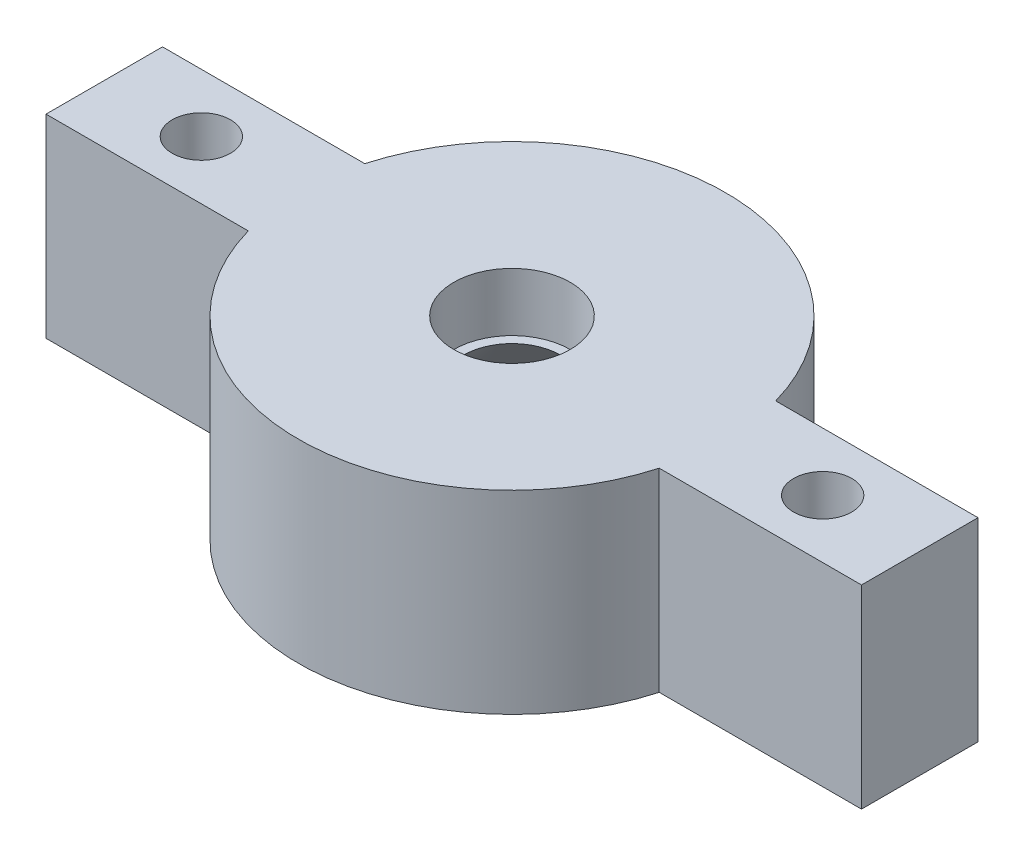
ISO-10303-21;
HEADER;
FILE_DESCRIPTION(('STEP AP214'),'2;1');
FILE_NAME('part.step','',(''),(''),'','','');
FILE_SCHEMA(('AUTOMOTIVE_DESIGN { 1 0 10303 214 1 1 1 1 }'));
ENDSEC;
DATA;
#1=APPLICATION_CONTEXT('core data for automotive mechanical design processes');
#2=APPLICATION_PROTOCOL_DEFINITION('international standard','automotive_design',2000,#1);
#3=PRODUCT_CONTEXT('',#1,'mechanical');
#4=PRODUCT('Part','Part','',(#3));
#5=PRODUCT_RELATED_PRODUCT_CATEGORY('part','',(#4));
#6=PRODUCT_DEFINITION_FORMATION('','',#4);
#7=PRODUCT_DEFINITION_CONTEXT('part definition',#1,'design');
#8=PRODUCT_DEFINITION('design','',#6,#7);
#9=PRODUCT_DEFINITION_SHAPE('','',#8);
#10=(LENGTH_UNIT() NAMED_UNIT(*) SI_UNIT(.MILLI.,.METRE.));
#11=(NAMED_UNIT(*) PLANE_ANGLE_UNIT() SI_UNIT($,.RADIAN.));
#12=(NAMED_UNIT(*) SI_UNIT($,.STERADIAN.) SOLID_ANGLE_UNIT());
#13=UNCERTAINTY_MEASURE_WITH_UNIT(LENGTH_MEASURE(1.E-05),#10,'distance_accuracy_value','');
#14=(GEOMETRIC_REPRESENTATION_CONTEXT(3) GLOBAL_UNCERTAINTY_ASSIGNED_CONTEXT((#13)) GLOBAL_UNIT_ASSIGNED_CONTEXT((#10,
#11,#12)) REPRESENTATION_CONTEXT('',''));
#15=CARTESIAN_POINT('',(0.,0.,0.));
#16=DIRECTION('',(0.,0.,1.));
#17=DIRECTION('',(1.,0.,0.));
#18=AXIS2_PLACEMENT_3D('',#15,#16,#17);
#19=CARTESIAN_POINT('',(42.,-5.,-3.));
#20=DIRECTION('',(0.,0.,1.));
#21=DIRECTION('',(1.,0.,0.));
#22=AXIS2_PLACEMENT_3D('',#19,#20,#21);
#23=PLANE('',#22);
#24=DIRECTION('',(-1.,0.,0.));
#25=VECTOR('',#24,1.);
#26=CARTESIAN_POINT('',(42.,-5.,-3.));
#27=LINE('',#26,#25);
#28=CARTESIAN_POINT('',(42.,-5.,-3.));
#29=VERTEX_POINT('',#28);
#30=CARTESIAN_POINT('',(31.5830052442584,-5.,-3.));
#31=VERTEX_POINT('',#30);
#32=EDGE_CURVE('E116',#29,#31,#27,.T.);
#33=ORIENTED_EDGE('',*,*,#32,.T.);
#34=DIRECTION('',(0.,1.,0.));
#35=VECTOR('',#34,1.);
#36=CARTESIAN_POINT('',(31.5830052442584,-36.1126983722081,-3.));
#37=LINE('',#36,#35);
#38=CARTESIAN_POINT('',(31.5830052442584,5.,-3.));
#39=VERTEX_POINT('',#38);
#40=EDGE_CURVE('E64',#31,#39,#37,.T.);
#41=ORIENTED_EDGE('',*,*,#40,.T.);
#42=DIRECTION('',(-1.,0.,0.));
#43=VECTOR('',#42,1.);
#44=CARTESIAN_POINT('',(42.,5.,-3.));
#45=LINE('',#44,#43);
#46=CARTESIAN_POINT('',(42.,5.,-3.));
#47=VERTEX_POINT('',#46);
#48=EDGE_CURVE('E49',#47,#39,#45,.T.);
#49=ORIENTED_EDGE('',*,*,#48,.F.);
#50=DIRECTION('',(0.,1.,0.));
#51=VECTOR('',#50,1.);
#52=CARTESIAN_POINT('',(42.,-5.,-3.));
#53=LINE('',#52,#51);
#54=EDGE_CURVE('E141',#29,#47,#53,.T.);
#55=ORIENTED_EDGE('',*,*,#54,.F.);
#56=EDGE_LOOP('',(#33,#41,#49,#55));
#57=FACE_BOUND('',#56,.T.);
#58=ADVANCED_FACE('F41',(#57),#23,.F.);
#59=CARTESIAN_POINT('',(42.,-5.,3.));
#60=DIRECTION('',(0.,0.,-1.));
#61=DIRECTION('',(-1.,0.,0.));
#62=AXIS2_PLACEMENT_3D('',#59,#60,#61);
#63=PLANE('',#62);
#64=DIRECTION('',(-1.,0.,0.));
#65=VECTOR('',#64,1.);
#66=CARTESIAN_POINT('',(42.,-5.,3.));
#67=LINE('',#66,#65);
#68=CARTESIAN_POINT('',(10.4169947557416,-5.,3.));
#69=VERTEX_POINT('',#68);
#70=CARTESIAN_POINT('',(0.,-5.,3.));
#71=VERTEX_POINT('',#70);
#72=EDGE_CURVE('E157',#69,#71,#67,.T.);
#73=ORIENTED_EDGE('',*,*,#72,.F.);
#74=DIRECTION('',(0.,1.,0.));
#75=VECTOR('',#74,1.);
#76=CARTESIAN_POINT('',(10.4169947557416,-36.1126983722081,3.));
#77=LINE('',#76,#75);
#78=CARTESIAN_POINT('',(10.4169947557416,5.,3.));
#79=VERTEX_POINT('',#78);
#80=EDGE_CURVE('E124',#69,#79,#77,.T.);
#81=ORIENTED_EDGE('',*,*,#80,.T.);
#82=DIRECTION('',(-1.,0.,0.));
#83=VECTOR('',#82,1.);
#84=CARTESIAN_POINT('',(42.,5.,3.));
#85=LINE('',#84,#83);
#86=CARTESIAN_POINT('',(0.,5.,3.));
#87=VERTEX_POINT('',#86);
#88=EDGE_CURVE('E161',#79,#87,#85,.T.);
#89=ORIENTED_EDGE('',*,*,#88,.T.);
#90=DIRECTION('',(0.,-1.,0.));
#91=VECTOR('',#90,1.);
#92=CARTESIAN_POINT('',(0.,-5.,3.));
#93=LINE('',#92,#91);
#94=EDGE_CURVE('E153',#87,#71,#93,.T.);
#95=ORIENTED_EDGE('',*,*,#94,.T.);
#96=EDGE_LOOP('',(#73,#81,#89,#95));
#97=FACE_BOUND('',#96,.T.);
#98=ADVANCED_FACE('F207',(#97),#63,.F.);
#99=CARTESIAN_POINT('',(10.4169947557416,5.,-3.));
#100=VERTEX_POINT('',#99);
#101=CARTESIAN_POINT('',(0.,5.,-3.));
#102=VERTEX_POINT('',#101);
#103=EDGE_CURVE('E56',#100,#102,#45,.T.);
#104=ORIENTED_EDGE('',*,*,#103,.F.);
#105=DIRECTION('',(0.,1.,0.));
#106=VECTOR('',#105,1.);
#107=CARTESIAN_POINT('',(10.4169947557416,-36.1126983722081,-3.));
#108=LINE('',#107,#106);
#109=CARTESIAN_POINT('',(10.4169947557416,-5.,-3.));
#110=VERTEX_POINT('',#109);
#111=EDGE_CURVE('E119',#100,#110,#108,.F.);
#112=ORIENTED_EDGE('',*,*,#111,.T.);
#113=CARTESIAN_POINT('',(0.,-5.,-3.));
#114=VERTEX_POINT('',#113);
#115=EDGE_CURVE('E108',#110,#114,#27,.T.);
#116=ORIENTED_EDGE('',*,*,#115,.T.);
#117=DIRECTION('',(0.,1.,0.));
#118=VECTOR('',#117,1.);
#119=CARTESIAN_POINT('',(0.,-5.,-3.));
#120=LINE('',#119,#118);
#121=EDGE_CURVE('E140',#114,#102,#120,.T.);
#122=ORIENTED_EDGE('',*,*,#121,.T.);
#123=EDGE_LOOP('',(#104,#112,#116,#122));
#124=FACE_BOUND('',#123,.T.);
#125=ADVANCED_FACE('F120',(#124),#23,.F.);
#126=CARTESIAN_POINT('',(42.,5.,3.));
#127=DIRECTION('',(0.,-1.,0.));
#128=DIRECTION('',(0.,0.,-1.));
#129=AXIS2_PLACEMENT_3D('',#126,#127,#128);
#130=PLANE('',#129);
#131=CARTESIAN_POINT('',(5.,5.,0.));
#132=DIRECTION('',(0.,-1.,0.));
#133=DIRECTION('',(0.,0.,-1.));
#134=AXIS2_PLACEMENT_3D('',#131,#132,#133);
#135=CIRCLE('',#134,1.5);
#136=CARTESIAN_POINT('',(5.,5.,-1.5));
#137=VERTEX_POINT('',#136);
#138=EDGE_CURVE('E175',#137,#137,#135,.F.);
#139=ORIENTED_EDGE('',*,*,#138,.F.);
#140=EDGE_LOOP('',(#139));
#141=FACE_BOUND('',#140,.T.);
#142=CARTESIAN_POINT('',(37.,5.,0.));
#143=DIRECTION('',(0.,-1.,0.));
#144=DIRECTION('',(0.,0.,-1.));
#145=AXIS2_PLACEMENT_3D('',#142,#143,#144);
#146=CIRCLE('',#145,1.49999999999999);
#147=CARTESIAN_POINT('',(37.,5.,-1.49999999999999));
#148=VERTEX_POINT('',#147);
#149=EDGE_CURVE('E428',#148,#148,#146,.F.);
#150=ORIENTED_EDGE('',*,*,#149,.F.);
#151=EDGE_LOOP('',(#150));
#152=FACE_BOUND('',#151,.T.);
#153=CARTESIAN_POINT('',(21.,5.,0.));
#154=DIRECTION('',(0.,-1.,0.));
#155=DIRECTION('',(0.,0.,-1.));
#156=AXIS2_PLACEMENT_3D('',#153,#154,#155);
#157=CIRCLE('',#156,3.);
#158=CARTESIAN_POINT('',(21.,5.,-3.));
#159=VERTEX_POINT('',#158);
#160=EDGE_CURVE('E165',#159,#159,#157,.T.);
#161=ORIENTED_EDGE('',*,*,#160,.T.);
#162=EDGE_LOOP('',(#161));
#163=FACE_BOUND('',#162,.T.);
#164=ORIENTED_EDGE('',*,*,#88,.F.);
#165=CARTESIAN_POINT('',(21.,5.,0.));
#166=DIRECTION('',(0.,1.,0.));
#167=DIRECTION('',(0.,0.,1.));
#168=AXIS2_PLACEMENT_3D('',#165,#166,#167);
#169=CIRCLE('',#168,11.);
#170=CARTESIAN_POINT('',(31.5830052442584,5.,3.));
#171=VERTEX_POINT('',#170);
#172=EDGE_CURVE('E134',#79,#171,#169,.T.);
#173=ORIENTED_EDGE('',*,*,#172,.T.);
#174=CARTESIAN_POINT('',(42.,5.,3.));
#175=VERTEX_POINT('',#174);
#176=EDGE_CURVE('E162',#175,#171,#85,.T.);
#177=ORIENTED_EDGE('',*,*,#176,.F.);
#178=DIRECTION('',(0.,0.,1.));
#179=VECTOR('',#178,1.);
#180=CARTESIAN_POINT('',(42.,5.,3.));
#181=LINE('',#180,#179);
#182=EDGE_CURVE('E144',#47,#175,#181,.T.);
#183=ORIENTED_EDGE('',*,*,#182,.F.);
#184=ORIENTED_EDGE('',*,*,#48,.T.);
#185=EDGE_CURVE('E132',#39,#100,#169,.T.);
#186=ORIENTED_EDGE('',*,*,#185,.T.);
#187=ORIENTED_EDGE('',*,*,#103,.T.);
#188=DIRECTION('',(0.,0.,1.));
#189=VECTOR('',#188,1.);
#190=CARTESIAN_POINT('',(0.,5.,3.));
#191=LINE('',#190,#189);
#192=EDGE_CURVE('E150',#102,#87,#191,.T.);
#193=ORIENTED_EDGE('',*,*,#192,.T.);
#194=EDGE_LOOP('',(#164,#173,#177,#183,#184,#186,#187,#193));
#195=FACE_BOUND('',#194,.T.);
#196=ADVANCED_FACE('F192',(#141,#152,#163,#195),#130,.F.);
#197=ORIENTED_EDGE('',*,*,#176,.T.);
#198=DIRECTION('',(0.,1.,0.));
#199=VECTOR('',#198,1.);
#200=CARTESIAN_POINT('',(31.5830052442584,-36.1126983722081,3.));
#201=LINE('',#200,#199);
#202=CARTESIAN_POINT('',(31.5830052442584,-5.,3.));
#203=VERTEX_POINT('',#202);
#204=EDGE_CURVE('E127',#171,#203,#201,.F.);
#205=ORIENTED_EDGE('',*,*,#204,.T.);
#206=CARTESIAN_POINT('',(42.,-5.,3.));
#207=VERTEX_POINT('',#206);
#208=EDGE_CURVE('E158',#207,#203,#67,.T.);
#209=ORIENTED_EDGE('',*,*,#208,.F.);
#210=DIRECTION('',(0.,-1.,0.));
#211=VECTOR('',#210,1.);
#212=CARTESIAN_POINT('',(42.,-5.,3.));
#213=LINE('',#212,#211);
#214=EDGE_CURVE('E146',#175,#207,#213,.T.);
#215=ORIENTED_EDGE('',*,*,#214,.F.);
#216=EDGE_LOOP('',(#197,#205,#209,#215));
#217=FACE_BOUND('',#216,.T.);
#218=ADVANCED_FACE('F202',(#217),#63,.F.);
#219=CARTESIAN_POINT('',(42.,-5.,3.));
#220=DIRECTION('',(0.,1.,0.));
#221=DIRECTION('',(0.,0.,1.));
#222=AXIS2_PLACEMENT_3D('',#219,#220,#221);
#223=PLANE('',#222);
#224=CARTESIAN_POINT('',(5.,-5.,0.));
#225=DIRECTION('',(0.,-1.,0.));
#226=DIRECTION('',(0.,0.,-1.));
#227=AXIS2_PLACEMENT_3D('',#224,#225,#226);
#228=CIRCLE('',#227,1.5);
#229=CARTESIAN_POINT('',(5.,-5.,-1.5));
#230=VERTEX_POINT('',#229);
#231=EDGE_CURVE('E180',#230,#230,#228,.T.);
#232=ORIENTED_EDGE('',*,*,#231,.F.);
#233=EDGE_LOOP('',(#232));
#234=FACE_BOUND('',#233,.T.);
#235=CARTESIAN_POINT('',(37.,-5.,0.));
#236=DIRECTION('',(0.,-1.,0.));
#237=DIRECTION('',(0.,0.,1.));
#238=AXIS2_PLACEMENT_3D('',#235,#236,#237);
#239=CIRCLE('',#238,1.49999999999999);
#240=CARTESIAN_POINT('',(37.,-5.,1.49999999999999));
#241=VERTEX_POINT('',#240);
#242=EDGE_CURVE('E183',#241,#241,#239,.T.);
#243=ORIENTED_EDGE('',*,*,#242,.F.);
#244=EDGE_LOOP('',(#243));
#245=FACE_BOUND('',#244,.T.);
#246=CARTESIAN_POINT('',(21.,-5.,0.));
#247=DIRECTION('',(0.,1.,0.));
#248=DIRECTION('',(0.,0.,1.));
#249=AXIS2_PLACEMENT_3D('',#246,#247,#248);
#250=CIRCLE('',#249,9.5);
#251=CARTESIAN_POINT('',(21.,-5.,9.5));
#252=VERTEX_POINT('',#251);
#253=EDGE_CURVE('E12',#252,#252,#250,.T.);
#254=ORIENTED_EDGE('',*,*,#253,.T.);
#255=EDGE_LOOP('',(#254));
#256=FACE_BOUND('',#255,.T.);
#257=ORIENTED_EDGE('',*,*,#115,.F.);
#258=CARTESIAN_POINT('',(21.,-5.,0.));
#259=DIRECTION('',(0.,1.,0.));
#260=DIRECTION('',(0.,0.,1.));
#261=AXIS2_PLACEMENT_3D('',#258,#259,#260);
#262=CIRCLE('',#261,11.);
#263=EDGE_CURVE('E112',#110,#31,#262,.F.);
#264=ORIENTED_EDGE('',*,*,#263,.T.);
#265=ORIENTED_EDGE('',*,*,#32,.F.);
#266=DIRECTION('',(0.,0.,-1.));
#267=VECTOR('',#266,1.);
#268=CARTESIAN_POINT('',(42.,-5.,3.));
#269=LINE('',#268,#267);
#270=EDGE_CURVE('E117',#207,#29,#269,.T.);
#271=ORIENTED_EDGE('',*,*,#270,.F.);
#272=ORIENTED_EDGE('',*,*,#208,.T.);
#273=EDGE_CURVE('E128',#203,#69,#262,.F.);
#274=ORIENTED_EDGE('',*,*,#273,.T.);
#275=ORIENTED_EDGE('',*,*,#72,.T.);
#276=DIRECTION('',(0.,0.,-1.));
#277=VECTOR('',#276,1.);
#278=CARTESIAN_POINT('',(0.,-5.,3.));
#279=LINE('',#278,#277);
#280=EDGE_CURVE('E114',#71,#114,#279,.T.);
#281=ORIENTED_EDGE('',*,*,#280,.T.);
#282=EDGE_LOOP('',(#257,#264,#265,#271,#272,#274,#275,#281));
#283=FACE_BOUND('',#282,.T.);
#284=ADVANCED_FACE('F109',(#234,#245,#256,#283),#223,.F.);
#285=CARTESIAN_POINT('',(42.,0.,0.));
#286=DIRECTION('',(-1.,0.,0.));
#287=DIRECTION('',(0.,0.,1.));
#288=AXIS2_PLACEMENT_3D('',#285,#286,#287);
#289=PLANE('',#288);
#290=ORIENTED_EDGE('',*,*,#54,.T.);
#291=ORIENTED_EDGE('',*,*,#182,.T.);
#292=ORIENTED_EDGE('',*,*,#214,.T.);
#293=ORIENTED_EDGE('',*,*,#270,.T.);
#294=EDGE_LOOP('',(#290,#291,#292,#293));
#295=FACE_BOUND('',#294,.T.);
#296=ADVANCED_FACE('F196',(#295),#289,.F.);
#297=CARTESIAN_POINT('',(0.,0.,0.));
#298=DIRECTION('',(-1.,0.,0.));
#299=DIRECTION('',(0.,0.,1.));
#300=AXIS2_PLACEMENT_3D('',#297,#298,#299);
#301=PLANE('',#300);
#302=ORIENTED_EDGE('',*,*,#121,.F.);
#303=ORIENTED_EDGE('',*,*,#280,.F.);
#304=ORIENTED_EDGE('',*,*,#94,.F.);
#305=ORIENTED_EDGE('',*,*,#192,.F.);
#306=EDGE_LOOP('',(#302,#303,#304,#305));
#307=FACE_BOUND('',#306,.T.);
#308=ADVANCED_FACE('F210',(#307),#301,.T.);
#309=CARTESIAN_POINT('',(21.,-36.1126983722081,0.));
#310=DIRECTION('',(0.,1.,0.));
#311=DIRECTION('',(0.,0.,1.));
#312=AXIS2_PLACEMENT_3D('',#309,#310,#311);
#313=CYLINDRICAL_SURFACE('',#312,11.);
#314=ORIENTED_EDGE('',*,*,#80,.F.);
#315=ORIENTED_EDGE('',*,*,#273,.F.);
#316=ORIENTED_EDGE('',*,*,#204,.F.);
#317=ORIENTED_EDGE('',*,*,#172,.F.);
#318=EDGE_LOOP('',(#314,#315,#316,#317));
#319=FACE_BOUND('',#318,.T.);
#320=ADVANCED_FACE('F204',(#319),#313,.T.);
#321=ORIENTED_EDGE('',*,*,#40,.F.);
#322=ORIENTED_EDGE('',*,*,#263,.F.);
#323=ORIENTED_EDGE('',*,*,#111,.F.);
#324=ORIENTED_EDGE('',*,*,#185,.F.);
#325=EDGE_LOOP('',(#321,#322,#323,#324));
#326=FACE_BOUND('',#325,.T.);
#327=ADVANCED_FACE('F126',(#326),#313,.T.);
#328=CARTESIAN_POINT('',(21.,2.,0.));
#329=DIRECTION('',(0.,-1.,0.));
#330=DIRECTION('',(0.,0.,-1.));
#331=AXIS2_PLACEMENT_3D('',#328,#329,#330);
#332=CONICAL_SURFACE('',#331,2.5,0.785398163397448);
#333=CARTESIAN_POINT('',(21.,-3.00000000000001,0.));
#334=DIRECTION('',(0.,1.,0.));
#335=DIRECTION('',(0.,0.,1.));
#336=AXIS2_PLACEMENT_3D('',#333,#334,#335);
#337=CIRCLE('',#336,7.5);
#338=CARTESIAN_POINT('',(21.,-3.,-7.5));
#339=VERTEX_POINT('',#338);
#340=EDGE_CURVE('E172',#339,#339,#337,.T.);
#341=CARTESIAN_POINT('',(21.,2.,0.));
#342=DIRECTION('',(0.,1.,0.));
#343=DIRECTION('',(0.,0.,1.));
#344=AXIS2_PLACEMENT_3D('',#341,#342,#343);
#345=CIRCLE('',#344,2.5);
#346=CARTESIAN_POINT('',(21.,2.,-2.5));
#347=VERTEX_POINT('',#346);
#348=EDGE_CURVE('E167',#347,#347,#345,.T.);
#349=CARTESIAN_POINT('',(21.,-3.,-7.5));
#350=CARTESIAN_POINT('',(21.,-2.94791666666667,-7.44791666666667));
#351=CARTESIAN_POINT('',(21.,-2.89583333333334,-7.39583333333333));
#352=CARTESIAN_POINT('',(21.,-2.79166666666667,-7.29166666666667));
#353=CARTESIAN_POINT('',(21.,-2.73958333333334,-7.23958333333333));
#354=CARTESIAN_POINT('',(21.,-2.63541666666667,-7.13541666666667));
#355=CARTESIAN_POINT('',(21.,-2.58333333333334,-7.08333333333333));
#356=CARTESIAN_POINT('',(21.,-2.47916666666667,-6.97916666666667));
#357=CARTESIAN_POINT('',(21.,-2.42708333333334,-6.92708333333333));
#358=CARTESIAN_POINT('',(21.,-2.32291666666667,-6.82291666666667));
#359=CARTESIAN_POINT('',(21.,-2.27083333333334,-6.77083333333333));
#360=CARTESIAN_POINT('',(21.,-2.16666666666667,-6.66666666666667));
#361=CARTESIAN_POINT('',(21.,-2.11458333333334,-6.61458333333333));
#362=CARTESIAN_POINT('',(21.,-2.01041666666667,-6.51041666666667));
#363=CARTESIAN_POINT('',(21.,-1.95833333333334,-6.45833333333333));
#364=CARTESIAN_POINT('',(21.,-1.85416666666667,-6.35416666666667));
#365=CARTESIAN_POINT('',(21.,-1.80208333333334,-6.30208333333333));
#366=CARTESIAN_POINT('',(21.,-1.69791666666667,-6.19791666666667));
#367=CARTESIAN_POINT('',(21.,-1.64583333333334,-6.14583333333333));
#368=CARTESIAN_POINT('',(21.,-1.54166666666667,-6.04166666666667));
#369=CARTESIAN_POINT('',(21.,-1.48958333333334,-5.98958333333333));
#370=CARTESIAN_POINT('',(21.,-1.38541666666667,-5.88541666666667));
#371=CARTESIAN_POINT('',(21.,-1.33333333333334,-5.83333333333333));
#372=CARTESIAN_POINT('',(21.,-1.22916666666667,-5.72916666666667));
#373=CARTESIAN_POINT('',(21.,-1.17708333333334,-5.67708333333333));
#374=CARTESIAN_POINT('',(21.,-1.07291666666667,-5.57291666666667));
#375=CARTESIAN_POINT('',(21.,-1.02083333333334,-5.52083333333333));
#376=CARTESIAN_POINT('',(21.,-0.916666666666671,-5.41666666666667));
#377=CARTESIAN_POINT('',(21.,-0.864583333333338,-5.36458333333333));
#378=CARTESIAN_POINT('',(21.,-0.760416666666671,-5.26041666666667));
#379=CARTESIAN_POINT('',(21.,-0.708333333333338,-5.20833333333333));
#380=CARTESIAN_POINT('',(21.,-0.604166666666671,-5.10416666666667));
#381=CARTESIAN_POINT('',(21.,-0.552083333333338,-5.05208333333333));
#382=CARTESIAN_POINT('',(21.,-0.447916666666671,-4.94791666666667));
#383=CARTESIAN_POINT('',(21.,-0.395833333333338,-4.89583333333333));
#384=CARTESIAN_POINT('',(21.,-0.291666666666671,-4.79166666666667));
#385=CARTESIAN_POINT('',(21.,-0.239583333333337,-4.73958333333333));
#386=CARTESIAN_POINT('',(21.,-0.135416666666671,-4.63541666666667));
#387=CARTESIAN_POINT('',(21.,-0.0833333333333376,-4.58333333333333));
#388=CARTESIAN_POINT('',(21.,0.020833333333329,-4.47916666666667));
#389=CARTESIAN_POINT('',(21.,0.0729166666666624,-4.42708333333333));
#390=CARTESIAN_POINT('',(21.,0.177083333333329,-4.32291666666667));
#391=CARTESIAN_POINT('',(21.,0.229166666666662,-4.27083333333333));
#392=CARTESIAN_POINT('',(21.,0.333333333333329,-4.16666666666667));
#393=CARTESIAN_POINT('',(21.,0.385416666666662,-4.11458333333333));
#394=CARTESIAN_POINT('',(21.,0.489583333333329,-4.01041666666667));
#395=CARTESIAN_POINT('',(21.,0.541666666666662,-3.95833333333333));
#396=CARTESIAN_POINT('',(21.,0.645833333333329,-3.85416666666667));
#397=CARTESIAN_POINT('',(21.,0.697916666666663,-3.80208333333333));
#398=CARTESIAN_POINT('',(21.,0.802083333333329,-3.69791666666667));
#399=CARTESIAN_POINT('',(21.,0.854166666666663,-3.64583333333333));
#400=CARTESIAN_POINT('',(21.,0.958333333333329,-3.54166666666667));
#401=CARTESIAN_POINT('',(21.,1.01041666666666,-3.48958333333333));
#402=CARTESIAN_POINT('',(21.,1.11458333333333,-3.38541666666667));
#403=CARTESIAN_POINT('',(21.,1.16666666666666,-3.33333333333333));
#404=CARTESIAN_POINT('',(21.,1.27083333333333,-3.22916666666667));
#405=CARTESIAN_POINT('',(21.,1.32291666666666,-3.17708333333333));
#406=CARTESIAN_POINT('',(21.,1.42708333333333,-3.07291666666667));
#407=CARTESIAN_POINT('',(21.,1.47916666666666,-3.02083333333333));
#408=CARTESIAN_POINT('',(21.,1.58333333333333,-2.91666666666667));
#409=CARTESIAN_POINT('',(21.,1.63541666666666,-2.86458333333333));
#410=CARTESIAN_POINT('',(21.,1.73958333333333,-2.76041666666667));
#411=CARTESIAN_POINT('',(21.,1.79166666666666,-2.70833333333333));
#412=CARTESIAN_POINT('',(21.,1.89583333333333,-2.60416666666667));
#413=CARTESIAN_POINT('',(21.,1.94791666666666,-2.55208333333333));
#414=CARTESIAN_POINT('',(21.,2.,-2.5));
#415=B_SPLINE_CURVE_WITH_KNOTS('',3,(#349,#350,#351,#352,#353,#354,#355,#356,#357,#358,#359,
#360,#361,#362,#363,#364,#365,#366,#367,#368,#369,#370,#371,#372,#373,#374,#375,#376,#377,#378,
#379,#380,#381,#382,#383,#384,#385,#386,#387,#388,#389,#390,#391,#392,#393,#394,#395,#396,#397,
#398,#399,#400,#401,#402,#403,#404,#405,#406,#407,#408,#409,#410,#411,#412,#413,#414),
.UNSPECIFIED.,.F.,.F.,(4,2,2,2,2,2,2,2,2,2,2,2,2,2,2,2,2,2,2,2,2,2,2,2,2,2,2,2,2,2,2,2,4),(0.,
0.220970869120796,0.441941738241593,0.662912607362389,0.883883476483185,1.10485434560398,
1.32582521472478,1.54679608384557,1.76776695296637,1.98873782208717,2.20970869120796,
2.43067956032876,2.65165042944955,2.87262129857035,3.09359216769115,3.31456303681194,
3.53553390593274,3.75650477505353,3.97747564417433,4.19844651329513,4.41941738241592,
4.64038825153672,4.86135912065751,5.08232998977831,5.30330085889911,5.5242717280199,
5.7452425971407,5.96621346626149,6.18718433538229,6.40815520450309,6.62912607362388,
6.85009694274468,7.07106781186548),.UNSPECIFIED.);
#416=EDGE_CURVE('BSEAM263',#339,#347,#415,.T.);
#417=ORIENTED_EDGE('',*,*,#340,.F.);
#418=ORIENTED_EDGE('',*,*,#348,.T.);
#419=ORIENTED_EDGE('',*,*,#416,.T.);
#420=ORIENTED_EDGE('',*,*,#416,.F.);
#421=EDGE_LOOP('',(#417,#419,#418,#420));
#422=FACE_BOUND('',#421,.T.);
#423=ADVANCED_FACE('F263',(#422),#332,.F.);
#424=CARTESIAN_POINT('',(21.,2.,0.));
#425=DIRECTION('',(0.,-1.,0.));
#426=DIRECTION('',(0.,0.,-1.));
#427=AXIS2_PLACEMENT_3D('',#424,#425,#426);
#428=PLANE('',#427);
#429=CARTESIAN_POINT('',(21.,2.,0.));
#430=DIRECTION('',(0.,-1.,0.));
#431=DIRECTION('',(0.,0.,-1.));
#432=AXIS2_PLACEMENT_3D('',#429,#430,#431);
#433=CIRCLE('',#432,3.);
#434=CARTESIAN_POINT('',(21.,2.,-3.));
#435=VERTEX_POINT('',#434);
#436=EDGE_CURVE('E168',#435,#435,#433,.T.);
#437=ORIENTED_EDGE('',*,*,#436,.F.);
#438=EDGE_LOOP('',(#437));
#439=FACE_BOUND('',#438,.T.);
#440=ORIENTED_EDGE('',*,*,#348,.F.);
#441=EDGE_LOOP('',(#440));
#442=FACE_BOUND('',#441,.T.);
#443=ADVANCED_FACE('F258',(#439,#442),#428,.F.);
#444=CARTESIAN_POINT('',(21.,15.,0.));
#445=DIRECTION('',(0.,-1.,0.));
#446=DIRECTION('',(0.,0.,-1.));
#447=AXIS2_PLACEMENT_3D('',#444,#445,#446);
#448=CYLINDRICAL_SURFACE('',#447,3.);
#449=CARTESIAN_POINT('',(21.,2.,-3.));
#450=CARTESIAN_POINT('',(21.,2.03125,-3.));
#451=CARTESIAN_POINT('',(21.,2.0625,-3.));
#452=CARTESIAN_POINT('',(21.,2.125,-3.));
#453=CARTESIAN_POINT('',(21.,2.15625,-3.));
#454=CARTESIAN_POINT('',(21.,2.21875,-3.));
#455=CARTESIAN_POINT('',(21.,2.25,-3.));
#456=CARTESIAN_POINT('',(21.,2.3125,-3.));
#457=CARTESIAN_POINT('',(21.,2.34375,-3.));
#458=CARTESIAN_POINT('',(21.,2.40625,-3.));
#459=CARTESIAN_POINT('',(21.,2.4375,-3.));
#460=CARTESIAN_POINT('',(21.,2.5,-3.));
#461=CARTESIAN_POINT('',(21.,2.53125,-3.));
#462=CARTESIAN_POINT('',(21.,2.59375,-3.));
#463=CARTESIAN_POINT('',(21.,2.625,-3.));
#464=CARTESIAN_POINT('',(21.,2.6875,-3.));
#465=CARTESIAN_POINT('',(21.,2.71875,-3.));
#466=CARTESIAN_POINT('',(21.,2.78125,-3.));
#467=CARTESIAN_POINT('',(21.,2.8125,-3.));
#468=CARTESIAN_POINT('',(21.,2.875,-3.));
#469=CARTESIAN_POINT('',(21.,2.90625,-3.));
#470=CARTESIAN_POINT('',(21.,2.96875,-3.));
#471=CARTESIAN_POINT('',(21.,3.,-3.));
#472=CARTESIAN_POINT('',(21.,3.0625,-3.));
#473=CARTESIAN_POINT('',(21.,3.09375,-3.));
#474=CARTESIAN_POINT('',(21.,3.15625,-3.));
#475=CARTESIAN_POINT('',(21.,3.1875,-3.));
#476=CARTESIAN_POINT('',(21.,3.25,-3.));
#477=CARTESIAN_POINT('',(21.,3.28125,-3.));
#478=CARTESIAN_POINT('',(21.,3.34375,-3.));
#479=CARTESIAN_POINT('',(21.,3.375,-3.));
#480=CARTESIAN_POINT('',(21.,3.4375,-3.));
#481=CARTESIAN_POINT('',(21.,3.46875,-3.));
#482=CARTESIAN_POINT('',(21.,3.53125,-3.));
#483=CARTESIAN_POINT('',(21.,3.5625,-3.));
#484=CARTESIAN_POINT('',(21.,3.625,-3.));
#485=CARTESIAN_POINT('',(21.,3.65625,-3.));
#486=CARTESIAN_POINT('',(21.,3.71875,-3.));
#487=CARTESIAN_POINT('',(21.,3.75,-3.));
#488=CARTESIAN_POINT('',(21.,3.8125,-3.));
#489=CARTESIAN_POINT('',(21.,3.84375,-3.));
#490=CARTESIAN_POINT('',(21.,3.90625,-3.));
#491=CARTESIAN_POINT('',(21.,3.9375,-3.));
#492=CARTESIAN_POINT('',(21.,4.,-3.));
#493=CARTESIAN_POINT('',(21.,4.03125,-3.));
#494=CARTESIAN_POINT('',(21.,4.09375,-3.));
#495=CARTESIAN_POINT('',(21.,4.125,-3.));
#496=CARTESIAN_POINT('',(21.,4.1875,-3.));
#497=CARTESIAN_POINT('',(21.,4.21875,-3.));
#498=CARTESIAN_POINT('',(21.,4.28125,-3.));
#499=CARTESIAN_POINT('',(21.,4.3125,-3.));
#500=CARTESIAN_POINT('',(21.,4.375,-3.));
#501=CARTESIAN_POINT('',(21.,4.40625,-3.));
#502=CARTESIAN_POINT('',(21.,4.46875,-3.));
#503=CARTESIAN_POINT('',(21.,4.5,-3.));
#504=CARTESIAN_POINT('',(21.,4.5625,-3.));
#505=CARTESIAN_POINT('',(21.,4.59375,-3.));
#506=CARTESIAN_POINT('',(21.,4.65625,-3.));
#507=CARTESIAN_POINT('',(21.,4.6875,-3.));
#508=CARTESIAN_POINT('',(21.,4.75,-3.));
#509=CARTESIAN_POINT('',(21.,4.78125,-3.));
#510=CARTESIAN_POINT('',(21.,4.84375,-3.));
#511=CARTESIAN_POINT('',(21.,4.875,-3.));
#512=CARTESIAN_POINT('',(21.,4.9375,-3.));
#513=CARTESIAN_POINT('',(21.,4.96875,-3.));
#514=CARTESIAN_POINT('',(21.,5.,-3.));
#515=B_SPLINE_CURVE_WITH_KNOTS('',3,(#449,#450,#451,#452,#453,#454,#455,#456,#457,#458,#459,
#460,#461,#462,#463,#464,#465,#466,#467,#468,#469,#470,#471,#472,#473,#474,#475,#476,#477,#478,
#479,#480,#481,#482,#483,#484,#485,#486,#487,#488,#489,#490,#491,#492,#493,#494,#495,#496,#497,
#498,#499,#500,#501,#502,#503,#504,#505,#506,#507,#508,#509,#510,#511,#512,#513,#514),
.UNSPECIFIED.,.F.,.F.,(4,2,2,2,2,2,2,2,2,2,2,2,2,2,2,2,2,2,2,2,2,2,2,2,2,2,2,2,2,2,2,2,4),(0.,
0.0937500000000001,0.1875,0.28125,0.375,0.46875,0.5625,0.656250000000001,0.750000000000001,
0.843750000000001,0.937500000000001,1.03125,1.125,1.21875,1.3125,1.40625,1.5,1.59375,1.6875,
1.78125,1.875,1.96875,2.0625,2.15625,2.25,2.34375,2.4375,2.53125,2.625,2.71875,2.8125,2.90625,
3.),.UNSPECIFIED.);
#516=EDGE_CURVE('BSEAM250',#435,#159,#515,.T.);
#517=ORIENTED_EDGE('',*,*,#436,.T.);
#518=ORIENTED_EDGE('',*,*,#160,.F.);
#519=ORIENTED_EDGE('',*,*,#516,.T.);
#520=ORIENTED_EDGE('',*,*,#516,.F.);
#521=EDGE_LOOP('',(#517,#519,#518,#520));
#522=FACE_BOUND('',#521,.T.);
#523=ADVANCED_FACE('F250',(#522),#448,.F.);
#524=CARTESIAN_POINT('',(21.,-3.,0.));
#525=DIRECTION('',(0.,1.,0.));
#526=DIRECTION('',(0.,0.,1.));
#527=AXIS2_PLACEMENT_3D('',#524,#525,#526);
#528=TOROIDAL_SURFACE('',#527,9.5,2.);
#529=ORIENTED_EDGE('',*,*,#253,.F.);
#530=EDGE_LOOP('',(#529));
#531=FACE_BOUND('',#530,.T.);
#532=ORIENTED_EDGE('',*,*,#340,.T.);
#533=EDGE_LOOP('',(#532));
#534=FACE_BOUND('',#533,.T.);
#535=ADVANCED_FACE('F43',(#531,#534),#528,.T.);
#536=CARTESIAN_POINT('',(37.,5.001,0.));
#537=DIRECTION('',(0.,-1.,0.));
#538=DIRECTION('',(0.,0.,-1.));
#539=AXIS2_PLACEMENT_3D('',#536,#537,#538);
#540=CYLINDRICAL_SURFACE('',#539,1.49999999999999);
#541=ORIENTED_EDGE('',*,*,#242,.T.);
#542=EDGE_LOOP('',(#541));
#543=FACE_BOUND('',#542,.T.);
#544=ORIENTED_EDGE('',*,*,#149,.T.);
#545=EDGE_LOOP('',(#544));
#546=FACE_BOUND('',#545,.T.);
#547=ADVANCED_FACE('F249',(#543,#546),#540,.F.);
#548=CARTESIAN_POINT('',(5.,5.001,0.));
#549=DIRECTION('',(0.,-1.,0.));
#550=DIRECTION('',(0.,0.,-1.));
#551=AXIS2_PLACEMENT_3D('',#548,#549,#550);
#552=CYLINDRICAL_SURFACE('',#551,1.5);
#553=ORIENTED_EDGE('',*,*,#231,.T.);
#554=EDGE_LOOP('',(#553));
#555=FACE_BOUND('',#554,.T.);
#556=ORIENTED_EDGE('',*,*,#138,.T.);
#557=EDGE_LOOP('',(#556));
#558=FACE_BOUND('',#557,.T.);
#559=ADVANCED_FACE('F255',(#555,#558),#552,.F.);
#560=CLOSED_SHELL('',(#58,#98,#125,#196,#218,#284,#296,#308,#320,#327,#423,#443,#523,#535,#547,#559));
#561=MANIFOLD_SOLID_BREP('B2',#560);
#562=ADVANCED_BREP_SHAPE_REPRESENTATION('',(#18,#561),#14);
#563=SHAPE_DEFINITION_REPRESENTATION(#9,#562);
ENDSEC;
END-ISO-10303-21;
